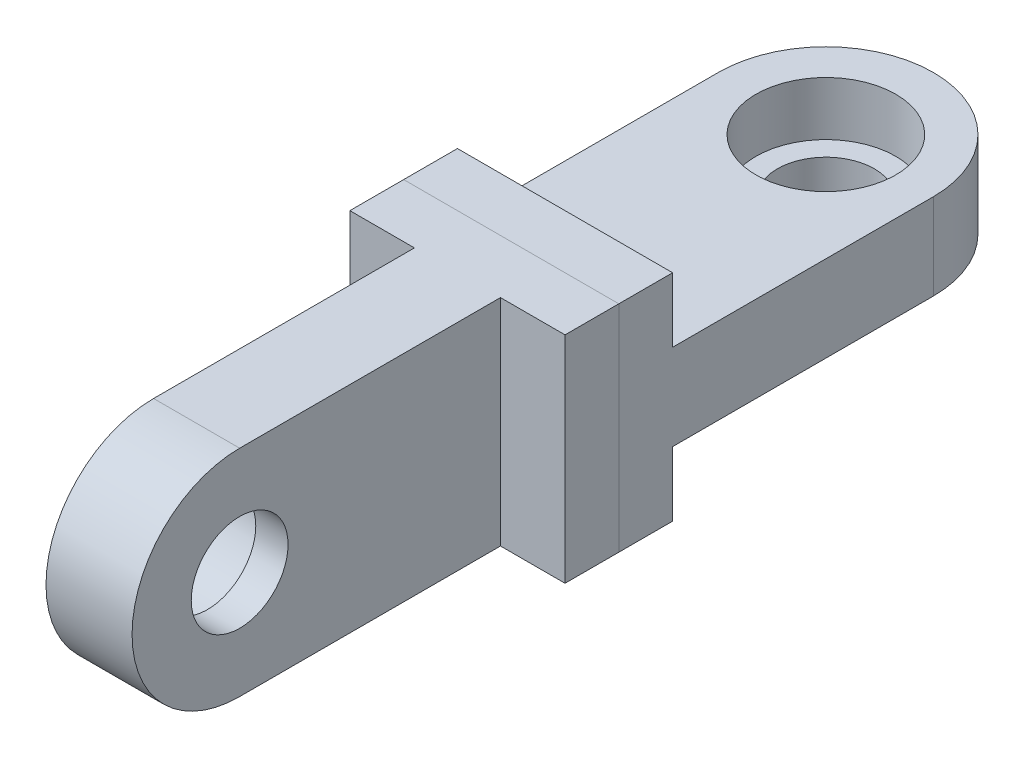
ISO-10303-21;
HEADER;
FILE_DESCRIPTION(('STEP AP214'),'2;1');
FILE_NAME('part.step','',(''),(''),'','','');
FILE_SCHEMA(('AUTOMOTIVE_DESIGN { 1 0 10303 214 1 1 1 1 }'));
ENDSEC;
DATA;
#1=APPLICATION_CONTEXT('core data for automotive mechanical design processes');
#2=APPLICATION_PROTOCOL_DEFINITION('international standard','automotive_design',2000,#1);
#3=PRODUCT_CONTEXT('',#1,'mechanical');
#4=PRODUCT('Part','Part','',(#3));
#5=PRODUCT_RELATED_PRODUCT_CATEGORY('part','',(#4));
#6=PRODUCT_DEFINITION_FORMATION('','',#4);
#7=PRODUCT_DEFINITION_CONTEXT('part definition',#1,'design');
#8=PRODUCT_DEFINITION('design','',#6,#7);
#9=PRODUCT_DEFINITION_SHAPE('','',#8);
#10=(LENGTH_UNIT() NAMED_UNIT(*) SI_UNIT(.MILLI.,.METRE.));
#11=(NAMED_UNIT(*) PLANE_ANGLE_UNIT() SI_UNIT($,.RADIAN.));
#12=(NAMED_UNIT(*) SI_UNIT($,.STERADIAN.) SOLID_ANGLE_UNIT());
#13=UNCERTAINTY_MEASURE_WITH_UNIT(LENGTH_MEASURE(1.E-05),#10,'distance_accuracy_value','');
#14=(GEOMETRIC_REPRESENTATION_CONTEXT(3) GLOBAL_UNCERTAINTY_ASSIGNED_CONTEXT((#13)) GLOBAL_UNIT_ASSIGNED_CONTEXT((#10,
#11,#12)) REPRESENTATION_CONTEXT('',''));
#15=CARTESIAN_POINT('',(0.,0.,0.));
#16=DIRECTION('',(0.,0.,1.));
#17=DIRECTION('',(1.,0.,0.));
#18=AXIS2_PLACEMENT_3D('',#15,#16,#17);
#19=CARTESIAN_POINT('',(0.,0.,40.1486937110615));
#20=DIRECTION('',(0.,0.,1.));
#21=DIRECTION('',(0.,1.,0.));
#22=AXIS2_PLACEMENT_3D('',#19,#20,#21);
#23=PLANE('',#22);
#24=DIRECTION('',(-1.,0.,0.));
#25=VECTOR('',#24,1.);
#26=CARTESIAN_POINT('',(-10.,9.99999999999997,40.1486937110615));
#27=LINE('',#26,#25);
#28=CARTESIAN_POINT('',(9.99999999999997,10.,40.1486937110615));
#29=VERTEX_POINT('',#28);
#30=CARTESIAN_POINT('',(-10.,9.99999999999997,40.1486937110615));
#31=VERTEX_POINT('',#30);
#32=EDGE_CURVE('E14',#29,#31,#27,.T.);
#33=ORIENTED_EDGE('',*,*,#32,.F.);
#34=DIRECTION('',(0.,1.,0.));
#35=VECTOR('',#34,1.);
#36=CARTESIAN_POINT('',(10.,-9.99999999999996,40.1486937110615));
#37=LINE('',#36,#35);
#38=CARTESIAN_POINT('',(10.,-9.99999999999996,40.1486937110615));
#39=VERTEX_POINT('',#38);
#40=EDGE_CURVE('E101',#39,#29,#37,.T.);
#41=ORIENTED_EDGE('',*,*,#40,.F.);
#42=DIRECTION('',(1.,0.,0.));
#43=VECTOR('',#42,1.);
#44=CARTESIAN_POINT('',(-9.99999999999996,-10.,40.1486937110615));
#45=LINE('',#44,#43);
#46=CARTESIAN_POINT('',(-9.99999999999996,-10.,40.1486937110615));
#47=VERTEX_POINT('',#46);
#48=EDGE_CURVE('E88',#47,#39,#45,.T.);
#49=ORIENTED_EDGE('',*,*,#48,.F.);
#50=DIRECTION('',(0.,-1.,0.));
#51=VECTOR('',#50,1.);
#52=CARTESIAN_POINT('',(-9.99999999999996,-10.,40.1486937110615));
#53=LINE('',#52,#51);
#54=EDGE_CURVE('E83',#31,#47,#53,.T.);
#55=ORIENTED_EDGE('',*,*,#54,.F.);
#56=EDGE_LOOP('',(#33,#41,#49,#55));
#57=FACE_BOUND('',#56,.T.);
#58=ADVANCED_FACE('F80',(#57),#23,.F.);
#59=CARTESIAN_POINT('',(1.,0.,69.3946812691347));
#60=DIRECTION('',(1.,0.,0.));
#61=DIRECTION('',(0.,0.,1.));
#62=AXIS2_PLACEMENT_3D('',#59,#60,#61);
#63=PLANE('',#62);
#64=CARTESIAN_POINT('',(1.,0.,69.3946812691347));
#65=DIRECTION('',(1.,0.,0.));
#66=DIRECTION('',(0.,0.,-1.));
#67=AXIS2_PLACEMENT_3D('',#64,#65,#66);
#68=CIRCLE('',#67,4.5);
#69=CARTESIAN_POINT('',(1.,0.,64.8946812691347));
#70=VERTEX_POINT('',#69);
#71=EDGE_CURVE('E208',#70,#70,#68,.F.);
#72=ORIENTED_EDGE('',*,*,#71,.F.);
#73=EDGE_LOOP('',(#72));
#74=FACE_BOUND('',#73,.T.);
#75=CARTESIAN_POINT('',(1.,0.,69.3946812691347));
#76=DIRECTION('',(-1.,0.,0.));
#77=DIRECTION('',(0.,0.,1.));
#78=AXIS2_PLACEMENT_3D('',#75,#76,#77);
#79=CIRCLE('',#78,6.5);
#80=CARTESIAN_POINT('',(1.,0.,75.8946812691347));
#81=VERTEX_POINT('',#80);
#82=EDGE_CURVE('E185',#81,#81,#79,.T.);
#83=ORIENTED_EDGE('',*,*,#82,.T.);
#84=EDGE_LOOP('',(#83));
#85=FACE_BOUND('',#84,.T.);
#86=ADVANCED_FACE('F240',(#74,#85),#63,.F.);
#87=CARTESIAN_POINT('',(1.,0.,69.3946812691347));
#88=DIRECTION('',(-1.,0.,0.));
#89=DIRECTION('',(0.,0.,1.));
#90=AXIS2_PLACEMENT_3D('',#87,#88,#89);
#91=CYLINDRICAL_SURFACE('',#90,6.5);
#92=ORIENTED_EDGE('',*,*,#82,.F.);
#93=EDGE_LOOP('',(#92));
#94=FACE_BOUND('',#93,.T.);
#95=CARTESIAN_POINT('',(-4.,0.,69.3946812691347));
#96=DIRECTION('',(-1.,0.,0.));
#97=DIRECTION('',(0.,0.,1.));
#98=AXIS2_PLACEMENT_3D('',#95,#96,#97);
#99=CIRCLE('',#98,6.5);
#100=CARTESIAN_POINT('',(-4.,0.,75.8946812691347));
#101=VERTEX_POINT('',#100);
#102=EDGE_CURVE('E268',#101,#101,#99,.T.);
#103=ORIENTED_EDGE('',*,*,#102,.T.);
#104=EDGE_LOOP('',(#103));
#105=FACE_BOUND('',#104,.T.);
#106=ADVANCED_FACE('F244',(#94,#105),#91,.F.);
#107=CARTESIAN_POINT('',(-25.,0.,69.3946812691347));
#108=DIRECTION('',(1.,0.,0.));
#109=DIRECTION('',(0.,0.,-1.));
#110=AXIS2_PLACEMENT_3D('',#107,#108,#109);
#111=CYLINDRICAL_SURFACE('',#110,4.5);
#112=CARTESIAN_POINT('',(4.,0.,69.3946812691347));
#113=DIRECTION('',(-1.,0.,0.));
#114=DIRECTION('',(0.,0.,1.));
#115=AXIS2_PLACEMENT_3D('',#112,#113,#114);
#116=CIRCLE('',#115,4.5);
#117=CARTESIAN_POINT('',(4.,0.,73.8946812691347));
#118=VERTEX_POINT('',#117);
#119=EDGE_CURVE('E156',#118,#118,#116,.T.);
#120=ORIENTED_EDGE('',*,*,#119,.F.);
#121=EDGE_LOOP('',(#120));
#122=FACE_BOUND('',#121,.T.);
#123=ORIENTED_EDGE('',*,*,#71,.T.);
#124=EDGE_LOOP('',(#123));
#125=FACE_BOUND('',#124,.T.);
#126=ADVANCED_FACE('F257',(#122,#125),#111,.F.);
#127=CARTESIAN_POINT('',(-3.99999999999991,-24.,80.297387422123));
#128=DIRECTION('',(-1.,0.,0.));
#129=DIRECTION('',(0.,0.,1.));
#130=AXIS2_PLACEMENT_3D('',#127,#128,#129);
#131=PLANE('',#130);
#132=ORIENTED_EDGE('',*,*,#102,.F.);
#133=EDGE_LOOP('',(#132));
#134=FACE_BOUND('',#133,.T.);
#135=CARTESIAN_POINT('',(-4.,0.,69.3946812691347));
#136=DIRECTION('',(-1.,0.,0.));
#137=DIRECTION('',(0.,0.,1.));
#138=AXIS2_PLACEMENT_3D('',#135,#136,#137);
#139=CIRCLE('',#138,10.);
#140=CARTESIAN_POINT('',(-4.00000000000003,9.99999999999998,69.3946812691347));
#141=VERTEX_POINT('',#140);
#142=CARTESIAN_POINT('',(-3.99999999999997,-10.,69.3946812691347));
#143=VERTEX_POINT('',#142);
#144=EDGE_CURVE('E211',#141,#143,#139,.F.);
#145=ORIENTED_EDGE('',*,*,#144,.F.);
#146=DIRECTION('',(0.,0.,1.));
#147=VECTOR('',#146,1.);
#148=CARTESIAN_POINT('',(-4.00000000000003,9.99999999999999,80.297387422123));
#149=LINE('',#148,#147);
#150=CARTESIAN_POINT('',(-4.00000000000003,9.99999999999999,45.1486937110615));
#151=VERTEX_POINT('',#150);
#152=EDGE_CURVE('E167',#151,#141,#149,.T.);
#153=ORIENTED_EDGE('',*,*,#152,.F.);
#154=DIRECTION('',(0.,1.,0.));
#155=VECTOR('',#154,1.);
#156=CARTESIAN_POINT('',(-3.99999999999991,-24.,45.1486937110615));
#157=LINE('',#156,#155);
#158=CARTESIAN_POINT('',(-3.99999999999996,-10.,45.1486937110615));
#159=VERTEX_POINT('',#158);
#160=EDGE_CURVE('E187',#159,#151,#157,.T.);
#161=ORIENTED_EDGE('',*,*,#160,.F.);
#162=DIRECTION('',(0.,0.,1.));
#163=VECTOR('',#162,1.);
#164=CARTESIAN_POINT('',(-3.99999999999996,-10.,80.297387422123));
#165=LINE('',#164,#163);
#166=EDGE_CURVE('E181',#159,#143,#165,.T.);
#167=ORIENTED_EDGE('',*,*,#166,.T.);
#168=EDGE_LOOP('',(#145,#153,#161,#167));
#169=FACE_BOUND('',#168,.T.);
#170=ADVANCED_FACE('F225',(#134,#169),#131,.T.);
#171=CARTESIAN_POINT('',(-25.,0.,69.3946812691347));
#172=DIRECTION('',(1.,0.,0.));
#173=DIRECTION('',(0.,0.,-1.));
#174=AXIS2_PLACEMENT_3D('',#171,#172,#173);
#175=CYLINDRICAL_SURFACE('',#174,10.);
#176=ORIENTED_EDGE('',*,*,#144,.T.);
#177=DIRECTION('',(1.,0.,0.));
#178=VECTOR('',#177,1.);
#179=CARTESIAN_POINT('',(-25.,-10.0000000000001,69.3946812691347));
#180=LINE('',#179,#178);
#181=CARTESIAN_POINT('',(4.00000000000004,-9.99999999999998,69.3946812691347));
#182=VERTEX_POINT('',#181);
#183=EDGE_CURVE('E152',#143,#182,#180,.T.);
#184=ORIENTED_EDGE('',*,*,#183,.T.);
#185=CARTESIAN_POINT('',(4.,0.,69.3946812691347));
#186=DIRECTION('',(-1.,0.,0.));
#187=DIRECTION('',(0.,0.,1.));
#188=AXIS2_PLACEMENT_3D('',#185,#186,#187);
#189=CIRCLE('',#188,10.);
#190=CARTESIAN_POINT('',(3.99999999999997,10.,69.3946812691347));
#191=VERTEX_POINT('',#190);
#192=EDGE_CURVE('E146',#182,#191,#189,.T.);
#193=ORIENTED_EDGE('',*,*,#192,.T.);
#194=DIRECTION('',(1.,0.,0.));
#195=VECTOR('',#194,1.);
#196=CARTESIAN_POINT('',(-25.,9.99999999999991,69.3946812691347));
#197=LINE('',#196,#195);
#198=EDGE_CURVE('E149',#141,#191,#197,.T.);
#199=ORIENTED_EDGE('',*,*,#198,.F.);
#200=EDGE_LOOP('',(#176,#184,#193,#199));
#201=FACE_BOUND('',#200,.T.);
#202=ADVANCED_FACE('F148',(#201),#175,.T.);
#203=CARTESIAN_POINT('',(4.00000000000009,-24.,80.297387422123));
#204=DIRECTION('',(1.,0.,0.));
#205=DIRECTION('',(0.,0.,-1.));
#206=AXIS2_PLACEMENT_3D('',#203,#204,#205);
#207=PLANE('',#206);
#208=ORIENTED_EDGE('',*,*,#119,.T.);
#209=EDGE_LOOP('',(#208));
#210=FACE_BOUND('',#209,.T.);
#211=ORIENTED_EDGE('',*,*,#192,.F.);
#212=DIRECTION('',(0.,0.,-1.));
#213=VECTOR('',#212,1.);
#214=CARTESIAN_POINT('',(4.00000000000004,-9.99999999999998,80.297387422123));
#215=LINE('',#214,#213);
#216=CARTESIAN_POINT('',(4.00000000000004,-9.99999999999998,45.1486937110615));
#217=VERTEX_POINT('',#216);
#218=EDGE_CURVE('E193',#182,#217,#215,.T.);
#219=ORIENTED_EDGE('',*,*,#218,.T.);
#220=DIRECTION('',(0.,1.,0.));
#221=VECTOR('',#220,1.);
#222=CARTESIAN_POINT('',(4.00000000000009,-24.,45.1486937110615));
#223=LINE('',#222,#221);
#224=CARTESIAN_POINT('',(3.99999999999997,10.,45.1486937110615));
#225=VERTEX_POINT('',#224);
#226=EDGE_CURVE('E171',#217,#225,#223,.T.);
#227=ORIENTED_EDGE('',*,*,#226,.T.);
#228=DIRECTION('',(0.,0.,-1.));
#229=VECTOR('',#228,1.);
#230=CARTESIAN_POINT('',(3.99999999999997,10.,80.297387422123));
#231=LINE('',#230,#229);
#232=EDGE_CURVE('E163',#191,#225,#231,.T.);
#233=ORIENTED_EDGE('',*,*,#232,.F.);
#234=EDGE_LOOP('',(#211,#219,#227,#233));
#235=FACE_BOUND('',#234,.T.);
#236=ADVANCED_FACE('F169',(#210,#235),#207,.T.);
#237=CARTESIAN_POINT('',(-9.99999999999991,-24.,45.1486937110615));
#238=DIRECTION('',(0.,0.,1.));
#239=DIRECTION('',(0.,1.,0.));
#240=AXIS2_PLACEMENT_3D('',#237,#238,#239);
#241=PLANE('',#240);
#242=DIRECTION('',(1.,0.,0.));
#243=VECTOR('',#242,1.);
#244=CARTESIAN_POINT('',(-9.99999999999996,-10.,45.1486937110615));
#245=LINE('',#244,#243);
#246=CARTESIAN_POINT('',(-9.99999999999996,-10.,45.1486937110615));
#247=VERTEX_POINT('',#246);
#248=EDGE_CURVE('E206',#247,#159,#245,.T.);
#249=ORIENTED_EDGE('',*,*,#248,.T.);
#250=ORIENTED_EDGE('',*,*,#160,.T.);
#251=DIRECTION('',(1.,0.,0.));
#252=VECTOR('',#251,1.);
#253=CARTESIAN_POINT('',(-10.,9.99999999999997,45.1486937110615));
#254=LINE('',#253,#252);
#255=CARTESIAN_POINT('',(-10.,9.99999999999997,45.1486937110615));
#256=VERTEX_POINT('',#255);
#257=EDGE_CURVE('E184',#256,#151,#254,.T.);
#258=ORIENTED_EDGE('',*,*,#257,.F.);
#259=DIRECTION('',(0.,1.,0.));
#260=VECTOR('',#259,1.);
#261=CARTESIAN_POINT('',(-9.99999999999991,-24.,45.1486937110615));
#262=LINE('',#261,#260);
#263=EDGE_CURVE('E177',#247,#256,#262,.T.);
#264=ORIENTED_EDGE('',*,*,#263,.F.);
#265=EDGE_LOOP('',(#249,#250,#258,#264));
#266=FACE_BOUND('',#265,.T.);
#267=ADVANCED_FACE('F223',(#266),#241,.T.);
#268=CARTESIAN_POINT('',(10.0000000000001,-24.,45.1486937110615));
#269=DIRECTION('',(0.,0.,1.));
#270=DIRECTION('',(0.,1.,0.));
#271=AXIS2_PLACEMENT_3D('',#268,#269,#270);
#272=PLANE('',#271);
#273=DIRECTION('',(1.,0.,0.));
#274=VECTOR('',#273,1.);
#275=CARTESIAN_POINT('',(-9.99999999999996,-10.,45.1486937110615));
#276=LINE('',#275,#274);
#277=CARTESIAN_POINT('',(10.,-9.99999999999996,45.1486937110615));
#278=VERTEX_POINT('',#277);
#279=EDGE_CURVE('E195',#217,#278,#276,.T.);
#280=ORIENTED_EDGE('',*,*,#279,.T.);
#281=DIRECTION('',(0.,1.,0.));
#282=VECTOR('',#281,1.);
#283=CARTESIAN_POINT('',(10.0000000000001,-24.,45.1486937110615));
#284=LINE('',#283,#282);
#285=CARTESIAN_POINT('',(9.99999999999998,10.,45.1486937110615));
#286=VERTEX_POINT('',#285);
#287=EDGE_CURVE('E173',#278,#286,#284,.T.);
#288=ORIENTED_EDGE('',*,*,#287,.T.);
#289=DIRECTION('',(1.,0.,0.));
#290=VECTOR('',#289,1.);
#291=CARTESIAN_POINT('',(9.99999999999998,10.,45.1486937110615));
#292=LINE('',#291,#290);
#293=EDGE_CURVE('E174',#225,#286,#292,.T.);
#294=ORIENTED_EDGE('',*,*,#293,.F.);
#295=ORIENTED_EDGE('',*,*,#226,.F.);
#296=EDGE_LOOP('',(#280,#288,#294,#295));
#297=FACE_BOUND('',#296,.T.);
#298=ADVANCED_FACE('F230',(#297),#272,.T.);
#299=CARTESIAN_POINT('',(-10.,9.99999999999997,80.297387422123));
#300=DIRECTION('',(0.,-1.,0.));
#301=DIRECTION('',(1.,0.,0.));
#302=AXIS2_PLACEMENT_3D('',#299,#300,#301);
#303=PLANE('',#302);
#304=DIRECTION('',(0.,0.,-1.));
#305=VECTOR('',#304,1.);
#306=CARTESIAN_POINT('',(9.99999999999997,10.,80.297387422123));
#307=LINE('',#306,#305);
#308=EDGE_CURVE('E197',#286,#29,#307,.T.);
#309=ORIENTED_EDGE('',*,*,#308,.T.);
#310=ORIENTED_EDGE('',*,*,#32,.T.);
#311=DIRECTION('',(0.,0.,-1.));
#312=VECTOR('',#311,1.);
#313=CARTESIAN_POINT('',(-10.,9.99999999999997,80.297387422123));
#314=LINE('',#313,#312);
#315=EDGE_CURVE('E203',#256,#31,#314,.T.);
#316=ORIENTED_EDGE('',*,*,#315,.F.);
#317=ORIENTED_EDGE('',*,*,#257,.T.);
#318=ORIENTED_EDGE('',*,*,#152,.T.);
#319=ORIENTED_EDGE('',*,*,#198,.T.);
#320=ORIENTED_EDGE('',*,*,#232,.T.);
#321=ORIENTED_EDGE('',*,*,#293,.T.);
#322=EDGE_LOOP('',(#309,#310,#316,#317,#318,#319,#320,#321));
#323=FACE_BOUND('',#322,.T.);
#324=ADVANCED_FACE('F161',(#323),#303,.F.);
#325=CARTESIAN_POINT('',(-9.99999999999996,-10.,80.297387422123));
#326=DIRECTION('',(0.,1.,0.));
#327=DIRECTION('',(-1.,0.,0.));
#328=AXIS2_PLACEMENT_3D('',#325,#326,#327);
#329=PLANE('',#328);
#330=DIRECTION('',(0.,0.,-1.));
#331=VECTOR('',#330,1.);
#332=CARTESIAN_POINT('',(-9.99999999999996,-10.,80.297387422123));
#333=LINE('',#332,#331);
#334=EDGE_CURVE('E201',#247,#47,#333,.T.);
#335=ORIENTED_EDGE('',*,*,#334,.T.);
#336=ORIENTED_EDGE('',*,*,#48,.T.);
#337=DIRECTION('',(0.,0.,-1.));
#338=VECTOR('',#337,1.);
#339=CARTESIAN_POINT('',(10.,-9.99999999999996,80.297387422123));
#340=LINE('',#339,#338);
#341=EDGE_CURVE('E199',#278,#39,#340,.T.);
#342=ORIENTED_EDGE('',*,*,#341,.F.);
#343=ORIENTED_EDGE('',*,*,#279,.F.);
#344=ORIENTED_EDGE('',*,*,#218,.F.);
#345=ORIENTED_EDGE('',*,*,#183,.F.);
#346=ORIENTED_EDGE('',*,*,#166,.F.);
#347=ORIENTED_EDGE('',*,*,#248,.F.);
#348=EDGE_LOOP('',(#335,#336,#342,#343,#344,#345,#346,#347));
#349=FACE_BOUND('',#348,.T.);
#350=ADVANCED_FACE('F219',(#349),#329,.F.);
#351=CARTESIAN_POINT('',(10.,-9.99999999999996,80.297387422123));
#352=DIRECTION('',(-1.,0.,0.));
#353=DIRECTION('',(0.,0.,1.));
#354=AXIS2_PLACEMENT_3D('',#351,#352,#353);
#355=PLANE('',#354);
#356=ORIENTED_EDGE('',*,*,#341,.T.);
#357=ORIENTED_EDGE('',*,*,#40,.T.);
#358=ORIENTED_EDGE('',*,*,#308,.F.);
#359=ORIENTED_EDGE('',*,*,#287,.F.);
#360=EDGE_LOOP('',(#356,#357,#358,#359));
#361=FACE_BOUND('',#360,.T.);
#362=ADVANCED_FACE('F227',(#361),#355,.F.);
#363=CARTESIAN_POINT('',(-9.99999999999996,-10.,80.297387422123));
#364=DIRECTION('',(1.,0.,0.));
#365=DIRECTION('',(0.,1.,0.));
#366=AXIS2_PLACEMENT_3D('',#363,#364,#365);
#367=PLANE('',#366);
#368=ORIENTED_EDGE('',*,*,#315,.T.);
#369=ORIENTED_EDGE('',*,*,#54,.T.);
#370=ORIENTED_EDGE('',*,*,#334,.F.);
#371=ORIENTED_EDGE('',*,*,#263,.T.);
#372=EDGE_LOOP('',(#368,#369,#370,#371));
#373=FACE_BOUND('',#372,.T.);
#374=ADVANCED_FACE('F215',(#373),#367,.F.);
#375=CLOSED_SHELL('',(#58,#86,#106,#126,#170,#202,#236,#267,#298,#324,#350,#362,#374));
#376=MANIFOLD_SOLID_BREP('B2',#375);
#377=CARTESIAN_POINT('',(0.,0.,40.1486937110615));
#378=DIRECTION('',(0.,0.,1.));
#379=DIRECTION('',(1.,0.,0.));
#380=AXIS2_PLACEMENT_3D('',#377,#378,#379);
#381=PLANE('',#380);
#382=DIRECTION('',(0.,1.,0.));
#383=VECTOR('',#382,1.);
#384=CARTESIAN_POINT('',(10.,10.,40.1486937110615));
#385=LINE('',#384,#383);
#386=CARTESIAN_POINT('',(10.,-10.,40.1486937110615));
#387=VERTEX_POINT('',#386);
#388=CARTESIAN_POINT('',(10.,10.,40.1486937110615));
#389=VERTEX_POINT('',#388);
#390=EDGE_CURVE('E445',#387,#389,#385,.T.);
#391=ORIENTED_EDGE('',*,*,#390,.T.);
#392=DIRECTION('',(-1.,0.,0.));
#393=VECTOR('',#392,1.);
#394=CARTESIAN_POINT('',(-10.,10.,40.1486937110615));
#395=LINE('',#394,#393);
#396=CARTESIAN_POINT('',(-10.,10.,40.1486937110615));
#397=VERTEX_POINT('',#396);
#398=EDGE_CURVE('E443',#389,#397,#395,.T.);
#399=ORIENTED_EDGE('',*,*,#398,.T.);
#400=DIRECTION('',(0.,-1.,0.));
#401=VECTOR('',#400,1.);
#402=CARTESIAN_POINT('',(-10.,10.,40.1486937110615));
#403=LINE('',#402,#401);
#404=CARTESIAN_POINT('',(-10.,-10.,40.1486937110615));
#405=VERTEX_POINT('',#404);
#406=EDGE_CURVE('E427',#397,#405,#403,.T.);
#407=ORIENTED_EDGE('',*,*,#406,.T.);
#408=DIRECTION('',(1.,0.,0.));
#409=VECTOR('',#408,1.);
#410=CARTESIAN_POINT('',(-10.,-10.,40.1486937110615));
#411=LINE('',#410,#409);
#412=EDGE_CURVE('E362',#405,#387,#411,.T.);
#413=ORIENTED_EDGE('',*,*,#412,.T.);
#414=EDGE_LOOP('',(#391,#399,#407,#413));
#415=FACE_BOUND('',#414,.T.);
#416=ADVANCED_FACE('F359',(#415),#381,.T.);
#417=CARTESIAN_POINT('',(10.,10.,80.297387422123));
#418=DIRECTION('',(-1.,0.,0.));
#419=DIRECTION('',(0.,-1.,0.));
#420=AXIS2_PLACEMENT_3D('',#417,#418,#419);
#421=PLANE('',#420);
#422=ORIENTED_EDGE('',*,*,#390,.F.);
#423=DIRECTION('',(0.,0.,-1.));
#424=VECTOR('',#423,1.);
#425=CARTESIAN_POINT('',(10.,-10.,80.297387422123));
#426=LINE('',#425,#424);
#427=CARTESIAN_POINT('',(10.,-10.,35.1486937110615));
#428=VERTEX_POINT('',#427);
#429=EDGE_CURVE('E436',#387,#428,#426,.T.);
#430=ORIENTED_EDGE('',*,*,#429,.T.);
#431=DIRECTION('',(0.,-1.,0.));
#432=VECTOR('',#431,1.);
#433=CARTESIAN_POINT('',(10.,-10.,35.1486937110615));
#434=LINE('',#433,#432);
#435=CARTESIAN_POINT('',(10.,-4.00000000000001,35.1486937110615));
#436=VERTEX_POINT('',#435);
#437=EDGE_CURVE('E486',#436,#428,#434,.T.);
#438=ORIENTED_EDGE('',*,*,#437,.F.);
#439=DIRECTION('',(0.,0.,1.));
#440=VECTOR('',#439,1.);
#441=CARTESIAN_POINT('',(10.,-4.,0.));
#442=LINE('',#441,#440);
#443=CARTESIAN_POINT('',(10.,-4.,10.9027061529883));
#444=VERTEX_POINT('',#443);
#445=EDGE_CURVE('E482',#444,#436,#442,.T.);
#446=ORIENTED_EDGE('',*,*,#445,.F.);
#447=DIRECTION('',(0.,-1.,0.));
#448=VECTOR('',#447,1.);
#449=CARTESIAN_POINT('',(9.99999999999999,25.,10.9027061529883));
#450=LINE('',#449,#448);
#451=CARTESIAN_POINT('',(10.,4.,10.9027061529883));
#452=VERTEX_POINT('',#451);
#453=EDGE_CURVE('E467',#452,#444,#450,.T.);
#454=ORIENTED_EDGE('',*,*,#453,.F.);
#455=DIRECTION('',(0.,0.,-1.));
#456=VECTOR('',#455,1.);
#457=CARTESIAN_POINT('',(10.,4.,0.));
#458=LINE('',#457,#456);
#459=CARTESIAN_POINT('',(10.,4.,35.1486937110615));
#460=VERTEX_POINT('',#459);
#461=EDGE_CURVE('E501',#460,#452,#458,.T.);
#462=ORIENTED_EDGE('',*,*,#461,.F.);
#463=DIRECTION('',(0.,-1.,0.));
#464=VECTOR('',#463,1.);
#465=CARTESIAN_POINT('',(10.,10.,35.1486937110615));
#466=LINE('',#465,#464);
#467=CARTESIAN_POINT('',(10.,10.,35.1486937110615));
#468=VERTEX_POINT('',#467);
#469=EDGE_CURVE('E478',#468,#460,#466,.T.);
#470=ORIENTED_EDGE('',*,*,#469,.F.);
#471=DIRECTION('',(0.,0.,-1.));
#472=VECTOR('',#471,1.);
#473=CARTESIAN_POINT('',(10.,10.,80.297387422123));
#474=LINE('',#473,#472);
#475=EDGE_CURVE('E459',#389,#468,#474,.T.);
#476=ORIENTED_EDGE('',*,*,#475,.F.);
#477=EDGE_LOOP('',(#422,#430,#438,#446,#454,#462,#470,#476));
#478=FACE_BOUND('',#477,.T.);
#479=ADVANCED_FACE('F542',(#478),#421,.F.);
#480=CARTESIAN_POINT('',(-10.,10.,80.297387422123));
#481=DIRECTION('',(1.,0.,0.));
#482=DIRECTION('',(0.,1.,0.));
#483=AXIS2_PLACEMENT_3D('',#480,#481,#482);
#484=PLANE('',#483);
#485=ORIENTED_EDGE('',*,*,#406,.F.);
#486=DIRECTION('',(0.,0.,-1.));
#487=VECTOR('',#486,1.);
#488=CARTESIAN_POINT('',(-10.,10.,80.297387422123));
#489=LINE('',#488,#487);
#490=CARTESIAN_POINT('',(-10.,10.,35.1486937110615));
#491=VERTEX_POINT('',#490);
#492=EDGE_CURVE('E437',#397,#491,#489,.T.);
#493=ORIENTED_EDGE('',*,*,#492,.T.);
#494=DIRECTION('',(0.,-1.,0.));
#495=VECTOR('',#494,1.);
#496=CARTESIAN_POINT('',(-10.,10.,35.1486937110615));
#497=LINE('',#496,#495);
#498=CARTESIAN_POINT('',(-10.,3.99999999999999,35.1486937110615));
#499=VERTEX_POINT('',#498);
#500=EDGE_CURVE('E454',#491,#499,#497,.T.);
#501=ORIENTED_EDGE('',*,*,#500,.T.);
#502=DIRECTION('',(0.,0.,-1.));
#503=VECTOR('',#502,1.);
#504=CARTESIAN_POINT('',(-10.,3.99999999999999,80.297387422123));
#505=LINE('',#504,#503);
#506=CARTESIAN_POINT('',(-10.,4.,10.9027061529883));
#507=VERTEX_POINT('',#506);
#508=EDGE_CURVE('E494',#499,#507,#505,.T.);
#509=ORIENTED_EDGE('',*,*,#508,.T.);
#510=DIRECTION('',(0.,-1.,0.));
#511=VECTOR('',#510,1.);
#512=CARTESIAN_POINT('',(-10.,25.,10.9027061529883));
#513=LINE('',#512,#511);
#514=CARTESIAN_POINT('',(-10.,-4.,10.9027061529883));
#515=VERTEX_POINT('',#514);
#516=EDGE_CURVE('E464',#507,#515,#513,.T.);
#517=ORIENTED_EDGE('',*,*,#516,.T.);
#518=DIRECTION('',(0.,0.,1.));
#519=VECTOR('',#518,1.);
#520=CARTESIAN_POINT('',(-10.,-4.00000000000001,80.297387422123));
#521=LINE('',#520,#519);
#522=CARTESIAN_POINT('',(-10.,-4.00000000000001,35.1486937110615));
#523=VERTEX_POINT('',#522);
#524=EDGE_CURVE('E514',#515,#523,#521,.T.);
#525=ORIENTED_EDGE('',*,*,#524,.T.);
#526=DIRECTION('',(0.,-1.,0.));
#527=VECTOR('',#526,1.);
#528=CARTESIAN_POINT('',(-10.,10.,35.1486937110615));
#529=LINE('',#528,#527);
#530=CARTESIAN_POINT('',(-10.,-10.,35.1486937110615));
#531=VERTEX_POINT('',#530);
#532=EDGE_CURVE('E430',#523,#531,#529,.T.);
#533=ORIENTED_EDGE('',*,*,#532,.T.);
#534=DIRECTION('',(0.,0.,-1.));
#535=VECTOR('',#534,1.);
#536=CARTESIAN_POINT('',(-10.,-10.,80.297387422123));
#537=LINE('',#536,#535);
#538=EDGE_CURVE('E424',#405,#531,#537,.T.);
#539=ORIENTED_EDGE('',*,*,#538,.F.);
#540=EDGE_LOOP('',(#485,#493,#501,#509,#517,#525,#533,#539));
#541=FACE_BOUND('',#540,.T.);
#542=ADVANCED_FACE('F426',(#541),#484,.F.);
#543=CARTESIAN_POINT('',(-10.,10.,80.297387422123));
#544=DIRECTION('',(0.,-1.,0.));
#545=DIRECTION('',(1.,0.,0.));
#546=AXIS2_PLACEMENT_3D('',#543,#544,#545);
#547=PLANE('',#546);
#548=ORIENTED_EDGE('',*,*,#398,.F.);
#549=ORIENTED_EDGE('',*,*,#475,.T.);
#550=DIRECTION('',(1.,0.,0.));
#551=VECTOR('',#550,1.);
#552=CARTESIAN_POINT('',(-24.,10.,35.1486937110615));
#553=LINE('',#552,#551);
#554=EDGE_CURVE('E505',#491,#468,#553,.T.);
#555=ORIENTED_EDGE('',*,*,#554,.F.);
#556=ORIENTED_EDGE('',*,*,#492,.F.);
#557=EDGE_LOOP('',(#548,#549,#555,#556));
#558=FACE_BOUND('',#557,.T.);
#559=ADVANCED_FACE('F549',(#558),#547,.F.);
#560=CARTESIAN_POINT('',(-10.,-10.,80.297387422123));
#561=DIRECTION('',(0.,1.,0.));
#562=DIRECTION('',(0.,0.,1.));
#563=AXIS2_PLACEMENT_3D('',#560,#561,#562);
#564=PLANE('',#563);
#565=ORIENTED_EDGE('',*,*,#412,.F.);
#566=ORIENTED_EDGE('',*,*,#538,.T.);
#567=DIRECTION('',(1.,0.,0.));
#568=VECTOR('',#567,1.);
#569=CARTESIAN_POINT('',(-24.,-10.,35.1486937110615));
#570=LINE('',#569,#568);
#571=EDGE_CURVE('E491',#531,#428,#570,.T.);
#572=ORIENTED_EDGE('',*,*,#571,.T.);
#573=ORIENTED_EDGE('',*,*,#429,.F.);
#574=EDGE_LOOP('',(#565,#566,#572,#573));
#575=FACE_BOUND('',#574,.T.);
#576=ADVANCED_FACE('F447',(#575),#564,.F.);
#577=CARTESIAN_POINT('',(-24.,4.,0.));
#578=DIRECTION('',(0.,-1.,0.));
#579=DIRECTION('',(0.,0.,-1.));
#580=AXIS2_PLACEMENT_3D('',#577,#578,#579);
#581=PLANE('',#580);
#582=CARTESIAN_POINT('',(0.,4.,10.9027061529883));
#583=DIRECTION('',(0.,-1.,0.));
#584=DIRECTION('',(0.,0.,-1.));
#585=AXIS2_PLACEMENT_3D('',#582,#583,#584);
#586=CIRCLE('',#585,6.5);
#587=CARTESIAN_POINT('',(0.,4.,4.40270615298831));
#588=VERTEX_POINT('',#587);
#589=EDGE_CURVE('E473',#588,#588,#586,.T.);
#590=ORIENTED_EDGE('',*,*,#589,.T.);
#591=EDGE_LOOP('',(#590));
#592=FACE_BOUND('',#591,.T.);
#593=CARTESIAN_POINT('',(0.,4.,10.9027061529883));
#594=DIRECTION('',(0.,-1.,0.));
#595=DIRECTION('',(0.,0.,-1.));
#596=AXIS2_PLACEMENT_3D('',#593,#594,#595);
#597=CIRCLE('',#596,10.);
#598=EDGE_CURVE('E380',#507,#452,#597,.T.);
#599=ORIENTED_EDGE('',*,*,#598,.F.);
#600=ORIENTED_EDGE('',*,*,#508,.F.);
#601=DIRECTION('',(1.,0.,0.));
#602=VECTOR('',#601,1.);
#603=CARTESIAN_POINT('',(-24.,3.99999999999999,35.1486937110615));
#604=LINE('',#603,#602);
#605=EDGE_CURVE('E485',#499,#460,#604,.T.);
#606=ORIENTED_EDGE('',*,*,#605,.T.);
#607=ORIENTED_EDGE('',*,*,#461,.T.);
#608=EDGE_LOOP('',(#599,#600,#606,#607));
#609=FACE_BOUND('',#608,.T.);
#610=ADVANCED_FACE('F553',(#592,#609),#581,.F.);
#611=CARTESIAN_POINT('',(-24.,-4.,0.));
#612=DIRECTION('',(0.,1.,0.));
#613=DIRECTION('',(0.,0.,1.));
#614=AXIS2_PLACEMENT_3D('',#611,#612,#613);
#615=PLANE('',#614);
#616=CARTESIAN_POINT('',(0.,-4.,10.9027061529883));
#617=DIRECTION('',(0.,-1.,0.));
#618=DIRECTION('',(0.,0.,-1.));
#619=AXIS2_PLACEMENT_3D('',#616,#617,#618);
#620=CIRCLE('',#619,4.5);
#621=CARTESIAN_POINT('',(0.,-4.,6.40270615298831));
#622=VERTEX_POINT('',#621);
#623=EDGE_CURVE('E78',#622,#622,#620,.T.);
#624=ORIENTED_EDGE('',*,*,#623,.F.);
#625=EDGE_LOOP('',(#624));
#626=FACE_BOUND('',#625,.T.);
#627=CARTESIAN_POINT('',(0.,-4.,10.9027061529883));
#628=DIRECTION('',(0.,-1.,0.));
#629=DIRECTION('',(0.,0.,-1.));
#630=AXIS2_PLACEMENT_3D('',#627,#628,#629);
#631=CIRCLE('',#630,10.);
#632=EDGE_CURVE('E368',#515,#444,#631,.T.);
#633=ORIENTED_EDGE('',*,*,#632,.T.);
#634=ORIENTED_EDGE('',*,*,#445,.T.);
#635=DIRECTION('',(1.,0.,0.));
#636=VECTOR('',#635,1.);
#637=CARTESIAN_POINT('',(-24.,-4.00000000000001,35.1486937110615));
#638=LINE('',#637,#636);
#639=EDGE_CURVE('E490',#523,#436,#638,.T.);
#640=ORIENTED_EDGE('',*,*,#639,.F.);
#641=ORIENTED_EDGE('',*,*,#524,.F.);
#642=EDGE_LOOP('',(#633,#634,#640,#641));
#643=FACE_BOUND('',#642,.T.);
#644=ADVANCED_FACE('F569',(#626,#643),#615,.F.);
#645=CARTESIAN_POINT('',(-24.,10.,35.1486937110615));
#646=DIRECTION('',(0.,0.,1.));
#647=DIRECTION('',(1.,0.,0.));
#648=AXIS2_PLACEMENT_3D('',#645,#646,#647);
#649=PLANE('',#648);
#650=ORIENTED_EDGE('',*,*,#554,.T.);
#651=ORIENTED_EDGE('',*,*,#469,.T.);
#652=ORIENTED_EDGE('',*,*,#605,.F.);
#653=ORIENTED_EDGE('',*,*,#500,.F.);
#654=EDGE_LOOP('',(#650,#651,#652,#653));
#655=FACE_BOUND('',#654,.T.);
#656=ADVANCED_FACE('F562',(#655),#649,.F.);
#657=CARTESIAN_POINT('',(-24.,-10.,35.1486937110615));
#658=DIRECTION('',(0.,0.,1.));
#659=DIRECTION('',(1.,0.,0.));
#660=AXIS2_PLACEMENT_3D('',#657,#658,#659);
#661=PLANE('',#660);
#662=ORIENTED_EDGE('',*,*,#639,.T.);
#663=ORIENTED_EDGE('',*,*,#437,.T.);
#664=ORIENTED_EDGE('',*,*,#571,.F.);
#665=ORIENTED_EDGE('',*,*,#532,.F.);
#666=EDGE_LOOP('',(#662,#663,#664,#665));
#667=FACE_BOUND('',#666,.T.);
#668=ADVANCED_FACE('F573',(#667),#661,.F.);
#669=CARTESIAN_POINT('',(0.,-1.,10.9027061529883));
#670=DIRECTION('',(0.,1.,0.));
#671=DIRECTION('',(0.,0.,1.));
#672=AXIS2_PLACEMENT_3D('',#669,#670,#671);
#673=CYLINDRICAL_SURFACE('',#672,6.5);
#674=CARTESIAN_POINT('',(0.,-1.,10.9027061529883));
#675=DIRECTION('',(0.,-1.,0.));
#676=DIRECTION('',(0.,0.,-1.));
#677=AXIS2_PLACEMENT_3D('',#674,#675,#676);
#678=CIRCLE('',#677,6.5);
#679=CARTESIAN_POINT('',(0.,-1.,4.40270615298831));
#680=VERTEX_POINT('',#679);
#681=EDGE_CURVE('E474',#680,#680,#678,.T.);
#682=ORIENTED_EDGE('',*,*,#681,.T.);
#683=EDGE_LOOP('',(#682));
#684=FACE_BOUND('',#683,.T.);
#685=ORIENTED_EDGE('',*,*,#589,.F.);
#686=EDGE_LOOP('',(#685));
#687=FACE_BOUND('',#686,.T.);
#688=ADVANCED_FACE('F539',(#684,#687),#673,.F.);
#689=CARTESIAN_POINT('',(0.,-1.,10.9027061529883));
#690=DIRECTION('',(0.,-1.,0.));
#691=DIRECTION('',(0.,0.,-1.));
#692=AXIS2_PLACEMENT_3D('',#689,#690,#691);
#693=PLANE('',#692);
#694=CARTESIAN_POINT('',(0.,-1.,10.9027061529883));
#695=DIRECTION('',(0.,-1.,0.));
#696=DIRECTION('',(0.,0.,-1.));
#697=AXIS2_PLACEMENT_3D('',#694,#695,#696);
#698=CIRCLE('',#697,4.5);
#699=CARTESIAN_POINT('',(0.,-1.,6.40270615298831));
#700=VERTEX_POINT('',#699);
#701=EDGE_CURVE('E470',#700,#700,#698,.T.);
#702=ORIENTED_EDGE('',*,*,#701,.T.);
#703=EDGE_LOOP('',(#702));
#704=FACE_BOUND('',#703,.T.);
#705=ORIENTED_EDGE('',*,*,#681,.F.);
#706=EDGE_LOOP('',(#705));
#707=FACE_BOUND('',#706,.T.);
#708=ADVANCED_FACE('F526',(#704,#707),#693,.F.);
#709=CARTESIAN_POINT('',(0.,25.,10.9027061529883));
#710=DIRECTION('',(0.,-1.,0.));
#711=DIRECTION('',(0.,0.,-1.));
#712=AXIS2_PLACEMENT_3D('',#709,#710,#711);
#713=CYLINDRICAL_SURFACE('',#712,4.5);
#714=ORIENTED_EDGE('',*,*,#623,.T.);
#715=EDGE_LOOP('',(#714));
#716=FACE_BOUND('',#715,.T.);
#717=ORIENTED_EDGE('',*,*,#701,.F.);
#718=EDGE_LOOP('',(#717));
#719=FACE_BOUND('',#718,.T.);
#720=ADVANCED_FACE('F529',(#716,#719),#713,.F.);
#721=CARTESIAN_POINT('',(0.,25.,10.9027061529883));
#722=DIRECTION('',(0.,-1.,0.));
#723=DIRECTION('',(0.,0.,-1.));
#724=AXIS2_PLACEMENT_3D('',#721,#722,#723);
#725=CYLINDRICAL_SURFACE('',#724,10.);
#726=ORIENTED_EDGE('',*,*,#598,.T.);
#727=ORIENTED_EDGE('',*,*,#453,.T.);
#728=ORIENTED_EDGE('',*,*,#632,.F.);
#729=ORIENTED_EDGE('',*,*,#516,.F.);
#730=EDGE_LOOP('',(#726,#727,#728,#729));
#731=FACE_BOUND('',#730,.T.);
#732=ADVANCED_FACE('F531',(#731),#725,.T.);
#733=CLOSED_SHELL('',(#416,#479,#542,#559,#576,#610,#644,#656,#668,#688,#708,#720,#732));
#734=MANIFOLD_SOLID_BREP('B8',#733);
#735=ADVANCED_BREP_SHAPE_REPRESENTATION('',(#18,#376,#734),#14);
#736=SHAPE_DEFINITION_REPRESENTATION(#9,#735);
ENDSEC;
END-ISO-10303-21;
